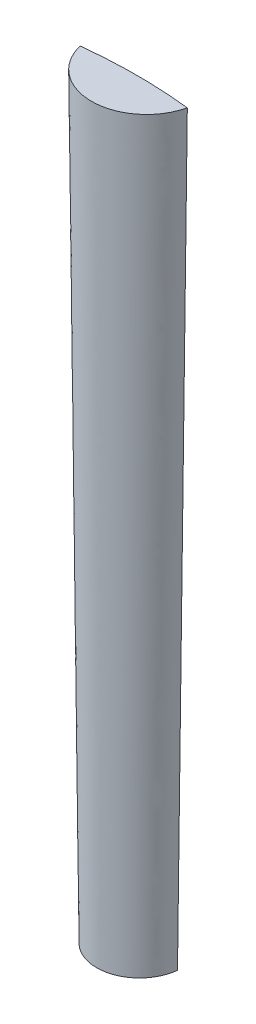
ISO-10303-21;
HEADER;
FILE_DESCRIPTION(('STEP AP214'),'2;1');
FILE_NAME('part.step','',(''),(''),'','','');
FILE_SCHEMA(('AUTOMOTIVE_DESIGN { 1 0 10303 214 1 1 1 1 }'));
ENDSEC;
DATA;
#1=APPLICATION_CONTEXT('core data for automotive mechanical design processes');
#2=APPLICATION_PROTOCOL_DEFINITION('international standard','automotive_design',2000,#1);
#3=PRODUCT_CONTEXT('',#1,'mechanical');
#4=PRODUCT('Part','Part','',(#3));
#5=PRODUCT_RELATED_PRODUCT_CATEGORY('part','',(#4));
#6=PRODUCT_DEFINITION_FORMATION('','',#4);
#7=PRODUCT_DEFINITION_CONTEXT('part definition',#1,'design');
#8=PRODUCT_DEFINITION('design','',#6,#7);
#9=PRODUCT_DEFINITION_SHAPE('','',#8);
#10=(LENGTH_UNIT() NAMED_UNIT(*) SI_UNIT(.MILLI.,.METRE.));
#11=(NAMED_UNIT(*) PLANE_ANGLE_UNIT() SI_UNIT($,.RADIAN.));
#12=(NAMED_UNIT(*) SI_UNIT($,.STERADIAN.) SOLID_ANGLE_UNIT());
#13=UNCERTAINTY_MEASURE_WITH_UNIT(LENGTH_MEASURE(1.E-05),#10,'distance_accuracy_value','');
#14=(GEOMETRIC_REPRESENTATION_CONTEXT(3) GLOBAL_UNCERTAINTY_ASSIGNED_CONTEXT((#13)) GLOBAL_UNIT_ASSIGNED_CONTEXT((#10,
#11,#12)) REPRESENTATION_CONTEXT('',''));
#15=CARTESIAN_POINT('',(0.,0.,0.));
#16=DIRECTION('',(0.,0.,1.));
#17=DIRECTION('',(1.,0.,0.));
#18=AXIS2_PLACEMENT_3D('',#15,#16,#17);
#19=CARTESIAN_POINT('',(30.150054,37.07,119.939056234041));
#20=DIRECTION('',(0.,1.,0.));
#21=DIRECTION('',(0.,0.,1.));
#22=AXIS2_PLACEMENT_3D('',#19,#20,#21);
#23=PLANE('',#22);
#24=CARTESIAN_POINT('',(8.85854642919392,37.07,0.941181344718849));
#25=CARTESIAN_POINT('',(8.95640675573987,37.07,1.8229135295629));
#26=CARTESIAN_POINT('',(9.11426897084287,37.07,2.74812956102248));
#27=CARTESIAN_POINT('',(9.58876264371107,37.07,4.67127192029743));
#28=CARTESIAN_POINT('',(9.9055544716288,37.07,5.66937362525799));
#29=CARTESIAN_POINT('',(10.7396621162991,37.07,7.7084154682375));
#30=CARTESIAN_POINT('',(11.2572794788236,37.07,8.74947954917583));
#31=CARTESIAN_POINT('',(12.5308657190523,37.07,10.8238399567567));
#32=CARTESIAN_POINT('',(13.2872707725823,37.07,11.8570937307825));
#33=CARTESIAN_POINT('',(15.0611621468239,37.07,13.8427822710349));
#34=CARTESIAN_POINT('',(16.0791094868264,37.07,14.7948794724182));
#35=CARTESIAN_POINT('',(18.3696994820502,37.07,16.5279943339092));
#36=CARTESIAN_POINT('',(19.6425931055066,37.07,17.3083430623552));
#37=CARTESIAN_POINT('',(22.3958826804727,37.07,18.6056210428242));
#38=CARTESIAN_POINT('',(23.8760609828149,37.07,19.1217317560735));
#39=CARTESIAN_POINT('',(26.9545097347071,37.07,19.8193878224051));
#40=CARTESIAN_POINT('',(28.5520375219088,37.07,20.0003529940726));
#41=CARTESIAN_POINT('',(31.7480704780912,37.07,20.0003529940726));
#42=CARTESIAN_POINT('',(33.3455982652929,37.07,19.8193878224052));
#43=CARTESIAN_POINT('',(36.4240470171851,37.07,19.1217317560735));
#44=CARTESIAN_POINT('',(37.9042253195273,37.07,18.6056210428242));
#45=CARTESIAN_POINT('',(40.6575148944934,37.07,17.3083430623552));
#46=CARTESIAN_POINT('',(41.9304085179498,37.07,16.5279943339092));
#47=CARTESIAN_POINT('',(44.2209985131736,37.07,14.7948794724182));
#48=CARTESIAN_POINT('',(45.2389458531761,37.07,13.842782271035));
#49=CARTESIAN_POINT('',(47.0128372274177,37.07,11.8570937307825));
#50=CARTESIAN_POINT('',(47.7692422809477,37.07,10.8238399567566));
#51=CARTESIAN_POINT('',(49.0428285211764,37.07,8.74947954917583));
#52=CARTESIAN_POINT('',(49.5604458837009,37.07,7.7084154682375));
#53=CARTESIAN_POINT('',(50.3945535283712,37.07,5.669373625258));
#54=CARTESIAN_POINT('',(50.7113453562889,37.07,4.67127192029743));
#55=CARTESIAN_POINT('',(51.1858390291571,37.07,2.74812956102248));
#56=CARTESIAN_POINT('',(51.3437012442601,37.07,1.82291352956291));
#57=CARTESIAN_POINT('',(51.4415615708061,37.07,0.941181344718855));
#58=B_SPLINE_CURVE_WITH_KNOTS('',3,(#24,#25,#26,#27,#28,#29,#30,#31,#32,#33,#34,#35,#36,#37,#38,
#39,#40,#41,#42,#43,#44,#45,#46,#47,#48,#49,#50,#51,#52,#53,#54,#55,#56,#57),.UNSPECIFIED.,.F.,
.F.,(4,2,2,2,2,2,2,2,2,2,2,2,2,2,2,2,4),(0.,0.0624999999999999,0.125,0.1875,0.25,0.3125,0.375,
0.4375,0.5,0.5625,0.625,0.6875,0.75,0.8125,0.875,0.9375,1.),.UNSPECIFIED.);
#59=CARTESIAN_POINT('',(8.85854642919399,37.07,0.94118134471885));
#60=VERTEX_POINT('',#59);
#61=CARTESIAN_POINT('',(51.441561570806,37.07,0.94118134471885));
#62=VERTEX_POINT('',#61);
#63=EDGE_CURVE('E48',#60,#62,#58,.T.);
#64=ORIENTED_EDGE('',*,*,#63,.F.);
#65=CARTESIAN_POINT('',(51.441561570806,37.07,0.94118134471885));
#66=CARTESIAN_POINT('',(37.265726126754,37.07,-0.314545028742849));
#67=CARTESIAN_POINT('',(23.0343818732461,37.07,-0.314545028742846));
#68=CARTESIAN_POINT('',(8.85854642919409,37.07,0.94118134471885));
#69=(BOUNDED_CURVE() B_SPLINE_CURVE(3,(#65,#66,#67,#68),.UNSPECIFIED.,.F.,
.F.) B_SPLINE_CURVE_WITH_KNOTS((4,4),(0.,1.),
.UNSPECIFIED.) CURVE() GEOMETRIC_REPRESENTATION_ITEM() RATIONAL_B_SPLINE_CURVE((1.,
0.997399692375414,0.997399692375414,1.)) REPRESENTATION_ITEM(''));
#70=EDGE_CURVE('E11',#62,#60,#69,.T.);
#71=ORIENTED_EDGE('',*,*,#70,.F.);
#72=EDGE_LOOP('',(#64,#71));
#73=FACE_BOUND('',#72,.T.);
#74=ADVANCED_FACE('F38',(#73),#23,.F.);
#75=CARTESIAN_POINT('',(30.150054,413.03,118.206236216964));
#76=DIRECTION('',(0.,-1.,0.));
#77=DIRECTION('',(0.,0.,-1.));
#78=AXIS2_PLACEMENT_3D('',#75,#76,#77);
#79=PLANE('',#78);
#80=CARTESIAN_POINT('',(56.8889341819319,413.03,1.48606736343224));
#81=CARTESIAN_POINT('',(56.6306051544495,413.03,2.56982448790761));
#82=CARTESIAN_POINT('',(56.2940267766323,413.03,3.6904729809065));
#83=CARTESIAN_POINT('',(55.4278772667257,413.03,5.98082358879241));
#84=CARTESIAN_POINT('',(54.8981175072021,413.03,7.15062243275994));
#85=CARTESIAN_POINT('',(53.6107764775867,413.03,9.49920950598671));
#86=CARTESIAN_POINT('',(52.85291885551,413.03,10.6780126619555));
#87=CARTESIAN_POINT('',(51.0834192278421,413.03,12.9870447498091));
#88=CARTESIAN_POINT('',(50.0714518535159,413.03,14.1171348854503));
#89=CARTESIAN_POINT('',(47.7858697829679,413.03,16.2552558127453));
#90=CARTESIAN_POINT('',(46.5119809245787,413.03,17.2629433709139));
#91=CARTESIAN_POINT('',(43.7222391361478,413.03,19.0739374568693));
#92=CARTESIAN_POINT('',(42.2063092548893,413.03,19.8767238498607));
#93=CARTESIAN_POINT('',(38.9855652691218,413.03,21.1999249652848));
#94=CARTESIAN_POINT('',(37.2809902146209,413.03,21.7197872972848));
#95=CARTESIAN_POINT('',(33.7673768873675,413.03,22.4202447829008));
#96=CARTESIAN_POINT('',(31.9588838502599,413.03,22.600477558148));
#97=CARTESIAN_POINT('',(28.3412241497401,413.03,22.600477558148));
#98=CARTESIAN_POINT('',(26.5327311126325,413.03,22.4202447829008));
#99=CARTESIAN_POINT('',(23.0191177853791,413.03,21.7197872972848));
#100=CARTESIAN_POINT('',(21.3145427308781,413.03,21.1999249652848));
#101=CARTESIAN_POINT('',(18.0937987451107,413.03,19.8767238498607));
#102=CARTESIAN_POINT('',(16.5778688638522,413.03,19.0739374568693));
#103=CARTESIAN_POINT('',(13.7881270754213,413.03,17.2629433709139));
#104=CARTESIAN_POINT('',(12.5142382170321,413.03,16.2552558127453));
#105=CARTESIAN_POINT('',(10.228656146484,413.03,14.1171348854503));
#106=CARTESIAN_POINT('',(9.21668877215783,413.03,12.9870447498091));
#107=CARTESIAN_POINT('',(7.44718914449,413.03,10.6780126619555));
#108=CARTESIAN_POINT('',(6.68933152241326,413.03,9.49920950598669));
#109=CARTESIAN_POINT('',(5.40199049279784,413.03,7.15062243275992));
#110=CARTESIAN_POINT('',(4.87223073327431,413.03,5.98082358879237));
#111=CARTESIAN_POINT('',(4.00608122336764,413.03,3.69047298090647));
#112=CARTESIAN_POINT('',(3.66950284555054,413.03,2.56982448790757));
#113=CARTESIAN_POINT('',(3.41117381806805,413.03,1.48606736343222));
#114=B_SPLINE_CURVE_WITH_KNOTS('',3,(#80,#81,#82,#83,#84,#85,#86,#87,#88,#89,#90,#91,#92,#93,
#94,#95,#96,#97,#98,#99,#100,#101,#102,#103,#104,#105,#106,#107,#108,#109,#110,#111,#112,#113),
.UNSPECIFIED.,.F.,.F.,(4,2,2,2,2,2,2,2,2,2,2,2,2,2,2,2,4),(0.,0.0625000000000001,0.125,0.1875,
0.25,0.3125,0.375,0.4375,0.5,0.5625,0.625,0.6875,0.75,0.8125,0.875,0.9375,1.),.UNSPECIFIED.);
#115=CARTESIAN_POINT('',(3.41117381806794,413.03,1.48606736343224));
#116=VERTEX_POINT('',#115);
#117=CARTESIAN_POINT('',(56.8889341819319,413.03,1.48606736343221));
#118=VERTEX_POINT('',#117);
#119=EDGE_CURVE('E73',#116,#118,#114,.F.);
#120=ORIENTED_EDGE('',*,*,#119,.T.);
#121=CARTESIAN_POINT('',(3.411173818068,413.03,1.48606736343224));
#122=CARTESIAN_POINT('',(21.2003489064734,413.03,-0.497397967354603));
#123=CARTESIAN_POINT('',(39.0997590935265,413.03,-0.49739796735462));
#124=CARTESIAN_POINT('',(56.8889341819319,413.03,1.48606736343221));
#125=(BOUNDED_CURVE() B_SPLINE_CURVE(3,(#121,#122,#123,#124),.UNSPECIFIED.,.F.,
.F.) B_SPLINE_CURVE_WITH_KNOTS((4,4),(0.,1.),
.UNSPECIFIED.) CURVE() GEOMETRIC_REPRESENTATION_ITEM() RATIONAL_B_SPLINE_CURVE((1.,
0.995894274448315,0.995894274448315,1.)) REPRESENTATION_ITEM(''));
#126=EDGE_CURVE('E70',#118,#116,#125,.F.);
#127=ORIENTED_EDGE('',*,*,#126,.T.);
#128=EDGE_LOOP('',(#120,#127));
#129=FACE_BOUND('',#128,.T.);
#130=ADVANCED_FACE('F72',(#129),#79,.F.);
#131=CARTESIAN_POINT('',(3.411173818068,413.03,1.48606736343224));
#132=CARTESIAN_POINT('',(8.85854642919409,37.07,0.94118134471885));
#133=CARTESIAN_POINT('',(21.2003489064734,413.03,-0.497397967354603));
#134=CARTESIAN_POINT('',(23.0343818732461,37.07,-0.314545028742846));
#135=CARTESIAN_POINT('',(39.0997590935265,413.03,-0.49739796735462));
#136=CARTESIAN_POINT('',(37.265726126754,37.07,-0.314545028742849));
#137=CARTESIAN_POINT('',(56.8889341819319,413.03,1.48606736343221));
#138=CARTESIAN_POINT('',(51.441561570806,37.07,0.94118134471885));
#139=(BOUNDED_SURFACE() B_SPLINE_SURFACE(3,1,((#131,#132),(#133,#134),(#135,#136),(#137,#138)),
.UNSPECIFIED.,.F.,.F.,.F.) B_SPLINE_SURFACE_WITH_KNOTS((4,4),(2,2),(0.,1.),(0.,1.),
.UNSPECIFIED.) GEOMETRIC_REPRESENTATION_ITEM() RATIONAL_B_SPLINE_SURFACE(((1.,1.),
(0.995894274448315,0.997399692375414),(0.995894274448315,0.997399692375414),(1.,1.))) REPRESENTATION_ITEM('') SURFACE());
#140=CARTESIAN_POINT('',(56.8889341819319,413.03,1.48606736343221));
#141=CARTESIAN_POINT('',(51.441561570806,37.07,0.94118134471885));
#142=(BOUNDED_CURVE() B_SPLINE_CURVE(1,(#140,#141),.UNSPECIFIED.,.F.,
.F.) B_SPLINE_CURVE_WITH_KNOTS((2,2),(0.,1.),
.UNSPECIFIED.) CURVE() GEOMETRIC_REPRESENTATION_ITEM() RATIONAL_B_SPLINE_CURVE((1.,1.)) REPRESENTATION_ITEM(''));
#143=EDGE_CURVE('E82',#118,#62,#142,.T.);
#144=CARTESIAN_POINT('',(8.85854642919409,37.07,0.94118134471885));
#145=CARTESIAN_POINT('',(3.411173818068,413.03,1.48606736343224));
#146=(BOUNDED_CURVE() B_SPLINE_CURVE(1,(#144,#145),.UNSPECIFIED.,.F.,
.F.) B_SPLINE_CURVE_WITH_KNOTS((2,2),(0.,1.),
.UNSPECIFIED.) CURVE() GEOMETRIC_REPRESENTATION_ITEM() RATIONAL_B_SPLINE_CURVE((1.,1.)) REPRESENTATION_ITEM(''));
#147=EDGE_CURVE('E55',#60,#116,#146,.T.);
#148=ORIENTED_EDGE('',*,*,#126,.F.);
#149=ORIENTED_EDGE('',*,*,#143,.T.);
#150=ORIENTED_EDGE('',*,*,#70,.T.);
#151=ORIENTED_EDGE('',*,*,#147,.T.);
#152=EDGE_LOOP('',(#148,#149,#150,#151));
#153=FACE_BOUND('',#152,.T.);
#154=ADVANCED_FACE('F86',(#153),#139,.T.);
#155=CARTESIAN_POINT('',(56.8889341819319,413.03,1.48606736343224));
#156=CARTESIAN_POINT('',(51.4415615708061,37.07,0.941181344718855));
#157=CARTESIAN_POINT('',(56.6306051544495,413.03,2.56982448790761));
#158=CARTESIAN_POINT('',(51.3437012442601,37.07,1.82291352956291));
#159=CARTESIAN_POINT('',(56.2940267766323,413.03,3.6904729809065));
#160=CARTESIAN_POINT('',(51.1858390291571,37.07,2.74812956102248));
#161=CARTESIAN_POINT('',(55.4278772667257,413.03,5.98082358879241));
#162=CARTESIAN_POINT('',(50.7113453562889,37.07,4.67127192029743));
#163=CARTESIAN_POINT('',(54.8981175072021,413.03,7.15062243275994));
#164=CARTESIAN_POINT('',(50.3945535283712,37.07,5.669373625258));
#165=CARTESIAN_POINT('',(53.6107764775867,413.03,9.49920950598671));
#166=CARTESIAN_POINT('',(49.5604458837009,37.07,7.7084154682375));
#167=CARTESIAN_POINT('',(52.85291885551,413.03,10.6780126619555));
#168=CARTESIAN_POINT('',(49.0428285211764,37.07,8.74947954917583));
#169=CARTESIAN_POINT('',(51.0834192278421,413.03,12.9870447498091));
#170=CARTESIAN_POINT('',(47.7692422809477,37.07,10.8238399567566));
#171=CARTESIAN_POINT('',(50.0714518535159,413.03,14.1171348854503));
#172=CARTESIAN_POINT('',(47.0128372274177,37.07,11.8570937307825));
#173=CARTESIAN_POINT('',(47.7858697829679,413.03,16.2552558127453));
#174=CARTESIAN_POINT('',(45.2389458531761,37.07,13.842782271035));
#175=CARTESIAN_POINT('',(46.5119809245787,413.03,17.2629433709139));
#176=CARTESIAN_POINT('',(44.2209985131736,37.07,14.7948794724182));
#177=CARTESIAN_POINT('',(43.7222391361478,413.03,19.0739374568693));
#178=CARTESIAN_POINT('',(41.9304085179498,37.07,16.5279943339092));
#179=CARTESIAN_POINT('',(42.2063092548893,413.03,19.8767238498607));
#180=CARTESIAN_POINT('',(40.6575148944934,37.07,17.3083430623552));
#181=CARTESIAN_POINT('',(38.9855652691218,413.03,21.1999249652848));
#182=CARTESIAN_POINT('',(37.9042253195273,37.07,18.6056210428242));
#183=CARTESIAN_POINT('',(37.2809902146209,413.03,21.7197872972848));
#184=CARTESIAN_POINT('',(36.4240470171851,37.07,19.1217317560735));
#185=CARTESIAN_POINT('',(33.7673768873675,413.03,22.4202447829008));
#186=CARTESIAN_POINT('',(33.3455982652929,37.07,19.8193878224052));
#187=CARTESIAN_POINT('',(31.9588838502599,413.03,22.600477558148));
#188=CARTESIAN_POINT('',(31.7480704780912,37.07,20.0003529940726));
#189=CARTESIAN_POINT('',(28.3412241497401,413.03,22.600477558148));
#190=CARTESIAN_POINT('',(28.5520375219088,37.07,20.0003529940726));
#191=CARTESIAN_POINT('',(26.5327311126325,413.03,22.4202447829008));
#192=CARTESIAN_POINT('',(26.9545097347071,37.07,19.8193878224051));
#193=CARTESIAN_POINT('',(23.0191177853791,413.03,21.7197872972848));
#194=CARTESIAN_POINT('',(23.8760609828149,37.07,19.1217317560735));
#195=CARTESIAN_POINT('',(21.3145427308781,413.03,21.1999249652848));
#196=CARTESIAN_POINT('',(22.3958826804727,37.07,18.6056210428242));
#197=CARTESIAN_POINT('',(18.0937987451107,413.03,19.8767238498607));
#198=CARTESIAN_POINT('',(19.6425931055066,37.07,17.3083430623552));
#199=CARTESIAN_POINT('',(16.5778688638522,413.03,19.0739374568693));
#200=CARTESIAN_POINT('',(18.3696994820502,37.07,16.5279943339092));
#201=CARTESIAN_POINT('',(13.7881270754213,413.03,17.2629433709139));
#202=CARTESIAN_POINT('',(16.0791094868264,37.07,14.7948794724182));
#203=CARTESIAN_POINT('',(12.5142382170321,413.03,16.2552558127453));
#204=CARTESIAN_POINT('',(15.0611621468239,37.07,13.8427822710349));
#205=CARTESIAN_POINT('',(10.228656146484,413.03,14.1171348854503));
#206=CARTESIAN_POINT('',(13.2872707725823,37.07,11.8570937307825));
#207=CARTESIAN_POINT('',(9.21668877215783,413.03,12.9870447498091));
#208=CARTESIAN_POINT('',(12.5308657190523,37.07,10.8238399567567));
#209=CARTESIAN_POINT('',(7.44718914449,413.03,10.6780126619555));
#210=CARTESIAN_POINT('',(11.2572794788236,37.07,8.74947954917583));
#211=CARTESIAN_POINT('',(6.68933152241326,413.03,9.49920950598669));
#212=CARTESIAN_POINT('',(10.7396621162991,37.07,7.7084154682375));
#213=CARTESIAN_POINT('',(5.40199049279784,413.03,7.15062243275992));
#214=CARTESIAN_POINT('',(9.9055544716288,37.07,5.66937362525799));
#215=CARTESIAN_POINT('',(4.87223073327431,413.03,5.98082358879237));
#216=CARTESIAN_POINT('',(9.58876264371107,37.07,4.67127192029743));
#217=CARTESIAN_POINT('',(4.00608122336764,413.03,3.69047298090647));
#218=CARTESIAN_POINT('',(9.11426897084287,37.07,2.74812956102248));
#219=CARTESIAN_POINT('',(3.66950284555054,413.03,2.56982448790757));
#220=CARTESIAN_POINT('',(8.95640675573987,37.07,1.8229135295629));
#221=CARTESIAN_POINT('',(3.41117381806805,413.03,1.48606736343222));
#222=CARTESIAN_POINT('',(8.85854642919392,37.07,0.941181344718849));
#223=B_SPLINE_SURFACE_WITH_KNOTS('',3,1,((#155,#156),(#157,#158),(#159,#160),(#161,#162),(#163,
#164),(#165,#166),(#167,#168),(#169,#170),(#171,#172),(#173,#174),(#175,#176),(#177,#178),(#179,
#180),(#181,#182),(#183,#184),(#185,#186),(#187,#188),(#189,#190),(#191,#192),(#193,#194),(#195,
#196),(#197,#198),(#199,#200),(#201,#202),(#203,#204),(#205,#206),(#207,#208),(#209,#210),(#211,
#212),(#213,#214),(#215,#216),(#217,#218),(#219,#220),(#221,#222)),.UNSPECIFIED.,.F.,.F.,.F.,(4,
2,2,2,2,2,2,2,2,2,2,2,2,2,2,2,4),(2,2),(0.,0.0625000000000001,0.125,0.1875,0.25,0.3125,0.375,
0.4375,0.5,0.5625,0.625,0.6875,0.75,0.8125,0.875,0.9375,1.),(0.,1.),.UNSPECIFIED.);
#224=ORIENTED_EDGE('',*,*,#119,.F.);
#225=ORIENTED_EDGE('',*,*,#147,.F.);
#226=ORIENTED_EDGE('',*,*,#63,.T.);
#227=ORIENTED_EDGE('',*,*,#143,.F.);
#228=EDGE_LOOP('',(#224,#225,#226,#227));
#229=FACE_BOUND('',#228,.T.);
#230=ADVANCED_FACE('F81',(#229),#223,.T.);
#231=CLOSED_SHELL('',(#74,#130,#154,#230));
#232=MANIFOLD_SOLID_BREP('B2',#231);
#233=ADVANCED_BREP_SHAPE_REPRESENTATION('',(#18,#232),#14);
#234=SHAPE_DEFINITION_REPRESENTATION(#9,#233);
ENDSEC;
END-ISO-10303-21;
